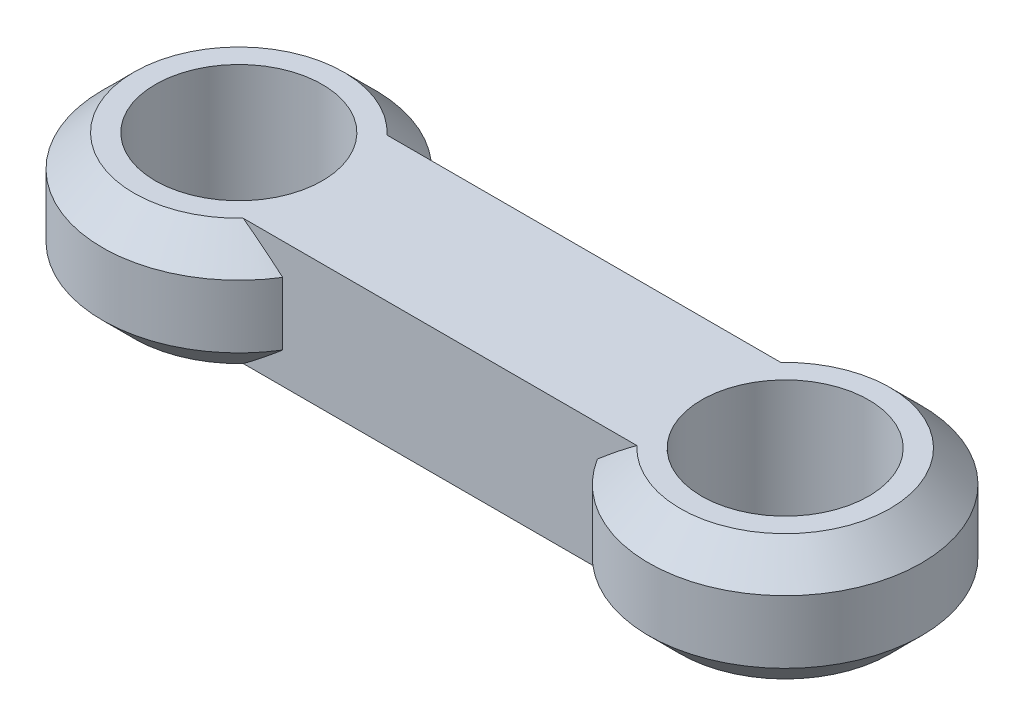
ISO-10303-21;
HEADER;
FILE_DESCRIPTION(('STEP AP214'),'2;1');
FILE_NAME('part.step','',(''),(''),'','','');
FILE_SCHEMA(('AUTOMOTIVE_DESIGN { 1 0 10303 214 1 1 1 1 }'));
ENDSEC;
DATA;
#1=APPLICATION_CONTEXT('core data for automotive mechanical design processes');
#2=APPLICATION_PROTOCOL_DEFINITION('international standard','automotive_design',2000,#1);
#3=PRODUCT_CONTEXT('',#1,'mechanical');
#4=PRODUCT('Part','Part','',(#3));
#5=PRODUCT_RELATED_PRODUCT_CATEGORY('part','',(#4));
#6=PRODUCT_DEFINITION_FORMATION('','',#4);
#7=PRODUCT_DEFINITION_CONTEXT('part definition',#1,'design');
#8=PRODUCT_DEFINITION('design','',#6,#7);
#9=PRODUCT_DEFINITION_SHAPE('','',#8);
#10=(LENGTH_UNIT() NAMED_UNIT(*) SI_UNIT(.MILLI.,.METRE.));
#11=(NAMED_UNIT(*) PLANE_ANGLE_UNIT() SI_UNIT($,.RADIAN.));
#12=(NAMED_UNIT(*) SI_UNIT($,.STERADIAN.) SOLID_ANGLE_UNIT());
#13=UNCERTAINTY_MEASURE_WITH_UNIT(LENGTH_MEASURE(1.E-05),#10,'distance_accuracy_value','');
#14=(GEOMETRIC_REPRESENTATION_CONTEXT(3) GLOBAL_UNCERTAINTY_ASSIGNED_CONTEXT((#13)) GLOBAL_UNIT_ASSIGNED_CONTEXT((#10,
#11,#12)) REPRESENTATION_CONTEXT('',''));
#15=CARTESIAN_POINT('',(0.,0.,0.));
#16=DIRECTION('',(0.,0.,1.));
#17=DIRECTION('',(1.,0.,0.));
#18=AXIS2_PLACEMENT_3D('',#15,#16,#17);
#19=CARTESIAN_POINT('',(-26.0425410570889,6.,0.));
#20=DIRECTION('',(0.,-1.,0.));
#21=DIRECTION('',(0.,0.,-1.));
#22=AXIS2_PLACEMENT_3D('',#19,#20,#21);
#23=CYLINDRICAL_SURFACE('',#22,6.5);
#24=DIRECTION('',(0.,-1.,0.));
#25=VECTOR('',#24,1.);
#26=CARTESIAN_POINT('',(-20.5212705285445,6.,-3.43009792143407));
#27=LINE('',#26,#25);
#28=CARTESIAN_POINT('',(-20.5212705285445,4.49999999999999,-3.43009792143407));
#29=VERTEX_POINT('',#28);
#30=CARTESIAN_POINT('',(-20.5212705285445,1.5,-3.43009792143407));
#31=VERTEX_POINT('',#30);
#32=EDGE_CURVE('E142',#29,#31,#27,.T.);
#33=ORIENTED_EDGE('',*,*,#32,.T.);
#34=CARTESIAN_POINT('',(-26.0425410570889,1.5,0.));
#35=DIRECTION('',(0.,1.,0.));
#36=DIRECTION('',(0.,0.,1.));
#37=AXIS2_PLACEMENT_3D('',#34,#35,#36);
#38=CIRCLE('',#37,6.5);
#39=CARTESIAN_POINT('',(-20.5212705285445,1.5,3.43009792143407));
#40=VERTEX_POINT('',#39);
#41=EDGE_CURVE('E167',#31,#40,#38,.T.);
#42=ORIENTED_EDGE('',*,*,#41,.T.);
#43=DIRECTION('',(0.,-1.,0.));
#44=VECTOR('',#43,1.);
#45=CARTESIAN_POINT('',(-20.5212705285445,6.,3.43009792143407));
#46=LINE('',#45,#44);
#47=CARTESIAN_POINT('',(-20.5212705285445,4.49999999999999,3.43009792143407));
#48=VERTEX_POINT('',#47);
#49=EDGE_CURVE('E147',#48,#40,#46,.T.);
#50=ORIENTED_EDGE('',*,*,#49,.F.);
#51=CARTESIAN_POINT('',(-26.0425410570889,4.49999999999999,0.));
#52=DIRECTION('',(0.,1.,0.));
#53=DIRECTION('',(0.,0.,1.));
#54=AXIS2_PLACEMENT_3D('',#51,#52,#53);
#55=CIRCLE('',#54,6.5);
#56=EDGE_CURVE('E164',#48,#29,#55,.F.);
#57=ORIENTED_EDGE('',*,*,#56,.T.);
#58=EDGE_LOOP('',(#33,#42,#50,#57));
#59=FACE_BOUND('',#58,.T.);
#60=ADVANCED_FACE('F49',(#59),#23,.T.);
#61=CARTESIAN_POINT('',(0.,6.,3.43009792143407));
#62=DIRECTION('',(0.,0.,1.));
#63=DIRECTION('',(1.,0.,0.));
#64=AXIS2_PLACEMENT_3D('',#61,#62,#63);
#65=PLANE('',#64);
#66=DIRECTION('',(-1.,0.,0.));
#67=VECTOR('',#66,1.);
#68=CARTESIAN_POINT('',(0.,0.,3.43009792143407));
#69=LINE('',#68,#67);
#70=CARTESIAN_POINT('',(-3.63791537138697,0.,3.43009792143407));
#71=VERTEX_POINT('',#70);
#72=CARTESIAN_POINT('',(-22.404625685702,0.,3.43009792143408));
#73=VERTEX_POINT('',#72);
#74=EDGE_CURVE('E270',#71,#73,#69,.T.);
#75=ORIENTED_EDGE('',*,*,#74,.F.);
#76=CARTESIAN_POINT('',(-3.63791537138697,0.,3.43009792143407));
#77=CARTESIAN_POINT('',(-3.71907569512446,0.0590566387520791,3.43009792143407));
#78=CARTESIAN_POINT('',(-3.79979677216606,0.118711737150157,3.43009792143407));
#79=CARTESIAN_POINT('',(-3.96044747830371,0.239071704787263,3.43009792143407));
#80=CARTESIAN_POINT('',(-4.04037714145387,0.299776528545755,3.43009792143407));
#81=CARTESIAN_POINT('',(-4.2790659016397,0.483211032410562,3.43009792143407));
#82=CARTESIAN_POINT('',(-4.43677984271871,0.607301105979159,3.43009792143407));
#83=CARTESIAN_POINT('',(-4.74995938949537,0.858232668240092,3.43009792143407));
#84=CARTESIAN_POINT('',(-4.90542528063672,0.985073802414717,3.43009792143407));
#85=CARTESIAN_POINT('',(-5.21458749276917,1.24100265865714,3.43009792143407));
#86=CARTESIAN_POINT('',(-5.36828319781378,1.37009112566234,3.43009792143407));
#87=CARTESIAN_POINT('',(-5.52127052854446,1.50000000000001,3.43009792143407));
#88=B_SPLINE_CURVE_WITH_KNOTS('',3,(#76,#77,#78,#79,#80,#81,#82,#83,#84,#85,#86,#87),
.UNSPECIFIED.,.F.,.F.,(4,2,2,2,2,4),(0.,0.301110719786002,0.602208426135549,1.20419905540656,
1.80611256423481,2.40822954254026),.UNSPECIFIED.);
#89=CARTESIAN_POINT('',(-5.52127052854446,1.50000000000001,3.43009792143407));
#90=VERTEX_POINT('',#89);
#91=EDGE_CURVE('E185',#71,#90,#88,.T.);
#92=ORIENTED_EDGE('',*,*,#91,.T.);
#93=DIRECTION('',(0.,-1.,0.));
#94=VECTOR('',#93,1.);
#95=CARTESIAN_POINT('',(-5.52127052854446,6.,3.43009792143407));
#96=LINE('',#95,#94);
#97=CARTESIAN_POINT('',(-5.52127052854446,4.5,3.43009792143407));
#98=VERTEX_POINT('',#97);
#99=EDGE_CURVE('E141',#98,#90,#96,.T.);
#100=ORIENTED_EDGE('',*,*,#99,.F.);
#101=CARTESIAN_POINT('',(-5.52127052854446,4.5,3.43009792143407));
#102=CARTESIAN_POINT('',(-5.36828319781378,4.62990887433767,3.43009792143407));
#103=CARTESIAN_POINT('',(-5.21458749276918,4.75899734134287,3.43009792143407));
#104=CARTESIAN_POINT('',(-4.90542528063673,5.01492619758529,3.43009792143407));
#105=CARTESIAN_POINT('',(-4.74995938949538,5.14176733175991,3.43009792143407));
#106=CARTESIAN_POINT('',(-4.43677984271872,5.39269889402084,3.43009792143407));
#107=CARTESIAN_POINT('',(-4.27906590163971,5.51678896758944,3.43009792143407));
#108=CARTESIAN_POINT('',(-4.04037714145388,5.70022347145425,3.43009792143407));
#109=CARTESIAN_POINT('',(-3.96044747830372,5.76092829521274,3.43009792143407));
#110=CARTESIAN_POINT('',(-3.79979677216608,5.88128826284984,3.43009792143407));
#111=CARTESIAN_POINT('',(-3.71907569512448,5.94094336124792,3.43009792143407));
#112=CARTESIAN_POINT('',(-3.63791537138699,6.,3.43009792143407));
#113=B_SPLINE_CURVE_WITH_KNOTS('',3,(#101,#102,#103,#104,#105,#106,#107,#108,#109,#110,#111,
#112),.UNSPECIFIED.,.F.,.F.,(4,2,2,2,2,4),(0.,0.602116978305447,1.20403048713369,
1.8060211164047,2.10711882275425,2.40822954254024),.UNSPECIFIED.);
#114=CARTESIAN_POINT('',(-3.63791537138699,6.,3.43009792143407));
#115=VERTEX_POINT('',#114);
#116=EDGE_CURVE('E129',#98,#115,#113,.T.);
#117=ORIENTED_EDGE('',*,*,#116,.T.);
#118=DIRECTION('',(-1.,0.,0.));
#119=VECTOR('',#118,1.);
#120=CARTESIAN_POINT('',(0.,6.,3.43009792143407));
#121=LINE('',#120,#119);
#122=CARTESIAN_POINT('',(-22.4046256857019,6.,3.43009792143408));
#123=VERTEX_POINT('',#122);
#124=EDGE_CURVE('E79',#115,#123,#121,.T.);
#125=ORIENTED_EDGE('',*,*,#124,.T.);
#126=CARTESIAN_POINT('',(-22.4046256857019,6.,3.43009792143408));
#127=CARTESIAN_POINT('',(-22.3234653619645,5.94094336124792,3.43009792143408));
#128=CARTESIAN_POINT('',(-22.2427442849228,5.88128826284984,3.43009792143408));
#129=CARTESIAN_POINT('',(-22.0820935787852,5.76092829521274,3.43009792143408));
#130=CARTESIAN_POINT('',(-22.002163915635,5.70022347145424,3.43009792143408));
#131=CARTESIAN_POINT('',(-21.7634751554492,5.51678896758944,3.43009792143408));
#132=CARTESIAN_POINT('',(-21.6057612143702,5.39269889402084,3.43009792143408));
#133=CARTESIAN_POINT('',(-21.2925816675936,5.1417673317599,3.43009792143408));
#134=CARTESIAN_POINT('',(-21.1371157764522,5.01492619758528,3.43009792143408));
#135=CARTESIAN_POINT('',(-20.8279535643197,4.75899734134286,3.43009792143408));
#136=CARTESIAN_POINT('',(-20.6742578592751,4.62990887433766,3.43009792143408));
#137=CARTESIAN_POINT('',(-20.5212705285445,4.49999999999999,3.43009792143408));
#138=B_SPLINE_CURVE_WITH_KNOTS('',3,(#126,#127,#128,#129,#130,#131,#132,#133,#134,#135,#136,
#137),.UNSPECIFIED.,.F.,.F.,(4,2,2,2,2,4),(0.,0.301110719786002,0.602208426135548,
1.20419905540656,1.80611256423481,2.40822954254026),.UNSPECIFIED.);
#139=EDGE_CURVE('E65',#123,#48,#138,.T.);
#140=ORIENTED_EDGE('',*,*,#139,.T.);
#141=ORIENTED_EDGE('',*,*,#49,.T.);
#142=CARTESIAN_POINT('',(-20.5212705285445,1.5,3.43009792143407));
#143=CARTESIAN_POINT('',(-20.6742578592751,1.37009112566233,3.43009792143408));
#144=CARTESIAN_POINT('',(-20.8279535643197,1.24100265865714,3.43009792143408));
#145=CARTESIAN_POINT('',(-21.1371157764522,0.985073802414715,3.43009792143408));
#146=CARTESIAN_POINT('',(-21.2925816675936,0.858232668240091,3.43009792143408));
#147=CARTESIAN_POINT('',(-21.6057612143702,0.607301105979158,3.43009792143408));
#148=CARTESIAN_POINT('',(-21.7634751554492,0.483211032410562,3.43009792143408));
#149=CARTESIAN_POINT('',(-22.0021639156351,0.299776528545756,3.43009792143408));
#150=CARTESIAN_POINT('',(-22.0820935787852,0.239071704787264,3.43009792143408));
#151=CARTESIAN_POINT('',(-22.2427442849229,0.118711737150158,3.43009792143408));
#152=CARTESIAN_POINT('',(-22.3234653619645,0.0590566387520798,3.43009792143408));
#153=CARTESIAN_POINT('',(-22.404625685702,0.,3.43009792143408));
#154=B_SPLINE_CURVE_WITH_KNOTS('',3,(#142,#143,#144,#145,#146,#147,#148,#149,#150,#151,#152,
#153),.UNSPECIFIED.,.F.,.F.,(4,2,2,2,2,4),(0.,0.602116978305453,1.2040304871337,
1.80602111640471,2.10711882275426,2.40822954254026),.UNSPECIFIED.);
#155=EDGE_CURVE('E218',#40,#73,#154,.T.);
#156=ORIENTED_EDGE('',*,*,#155,.T.);
#157=EDGE_LOOP('',(#75,#92,#100,#117,#125,#140,#141,#156));
#158=FACE_BOUND('',#157,.T.);
#159=ADVANCED_FACE('F243',(#158),#65,.T.);
#160=CARTESIAN_POINT('',(0.,6.,0.));
#161=DIRECTION('',(0.,-1.,0.));
#162=DIRECTION('',(0.,0.,-1.));
#163=AXIS2_PLACEMENT_3D('',#160,#161,#162);
#164=CYLINDRICAL_SURFACE('',#163,6.5);
#165=ORIENTED_EDGE('',*,*,#99,.T.);
#166=CARTESIAN_POINT('',(0.,1.50000000000001,0.));
#167=DIRECTION('',(0.,1.,0.));
#168=DIRECTION('',(0.,0.,1.));
#169=AXIS2_PLACEMENT_3D('',#166,#167,#168);
#170=CIRCLE('',#169,6.5);
#171=CARTESIAN_POINT('',(-5.52127052854446,1.50000000000001,-3.43009792143407));
#172=VERTEX_POINT('',#171);
#173=EDGE_CURVE('E139',#90,#172,#170,.T.);
#174=ORIENTED_EDGE('',*,*,#173,.T.);
#175=DIRECTION('',(0.,-1.,0.));
#176=VECTOR('',#175,1.);
#177=CARTESIAN_POINT('',(-5.52127052854446,6.,-3.43009792143407));
#178=LINE('',#177,#176);
#179=CARTESIAN_POINT('',(-5.52127052854446,4.5,-3.43009792143407));
#180=VERTEX_POINT('',#179);
#181=EDGE_CURVE('E124',#180,#172,#178,.T.);
#182=ORIENTED_EDGE('',*,*,#181,.F.);
#183=CARTESIAN_POINT('',(0.,4.5,0.));
#184=DIRECTION('',(0.,1.,0.));
#185=DIRECTION('',(0.,0.,1.));
#186=AXIS2_PLACEMENT_3D('',#183,#184,#185);
#187=CIRCLE('',#186,6.5);
#188=EDGE_CURVE('E136',#180,#98,#187,.F.);
#189=ORIENTED_EDGE('',*,*,#188,.T.);
#190=EDGE_LOOP('',(#165,#174,#182,#189));
#191=FACE_BOUND('',#190,.T.);
#192=ADVANCED_FACE('F135',(#191),#164,.T.);
#193=CARTESIAN_POINT('',(0.,6.,-3.43009792143407));
#194=DIRECTION('',(0.,0.,1.));
#195=DIRECTION('',(1.,0.,0.));
#196=AXIS2_PLACEMENT_3D('',#193,#194,#195);
#197=PLANE('',#196);
#198=DIRECTION('',(-1.,0.,0.));
#199=VECTOR('',#198,1.);
#200=CARTESIAN_POINT('',(0.,0.,-3.43009792143407));
#201=LINE('',#200,#199);
#202=CARTESIAN_POINT('',(-3.63791537138697,0.,-3.43009792143407));
#203=VERTEX_POINT('',#202);
#204=CARTESIAN_POINT('',(-22.404625685702,0.,-3.43009792143407));
#205=VERTEX_POINT('',#204);
#206=EDGE_CURVE('E273',#203,#205,#201,.T.);
#207=ORIENTED_EDGE('',*,*,#206,.T.);
#208=CARTESIAN_POINT('',(-22.404625685702,0.,-3.43009792143407));
#209=CARTESIAN_POINT('',(-22.3234653619645,0.0590566387520793,-3.43009792143407));
#210=CARTESIAN_POINT('',(-22.2427442849229,0.118711737150157,-3.43009792143407));
#211=CARTESIAN_POINT('',(-22.0820935787852,0.239071704787263,-3.43009792143407));
#212=CARTESIAN_POINT('',(-22.0021639156351,0.299776528545755,-3.43009792143407));
#213=CARTESIAN_POINT('',(-21.7634751554492,0.483211032410562,-3.43009792143407));
#214=CARTESIAN_POINT('',(-21.6057612143702,0.607301105979158,-3.43009792143407));
#215=CARTESIAN_POINT('',(-21.2925816675936,0.858232668240091,-3.43009792143407));
#216=CARTESIAN_POINT('',(-21.1371157764522,0.985073802414715,-3.43009792143407));
#217=CARTESIAN_POINT('',(-20.8279535643198,1.24100265865714,-3.43009792143407));
#218=CARTESIAN_POINT('',(-20.6742578592751,1.37009112566233,-3.43009792143407));
#219=CARTESIAN_POINT('',(-20.5212705285445,1.5,-3.43009792143407));
#220=B_SPLINE_CURVE_WITH_KNOTS('',3,(#208,#209,#210,#211,#212,#213,#214,#215,#216,#217,#218,
#219),.UNSPECIFIED.,.F.,.F.,(4,2,2,2,2,4),(0.,0.301110719786001,0.60220842613555,
1.20419905540656,1.80611256423481,2.40822954254026),.UNSPECIFIED.);
#221=EDGE_CURVE('E130',#205,#31,#220,.T.);
#222=ORIENTED_EDGE('',*,*,#221,.T.);
#223=ORIENTED_EDGE('',*,*,#32,.F.);
#224=CARTESIAN_POINT('',(-20.5212705285445,4.49999999999999,-3.43009792143407));
#225=CARTESIAN_POINT('',(-20.6742578592751,4.62990887433766,-3.43009792143407));
#226=CARTESIAN_POINT('',(-20.8279535643197,4.75899734134286,-3.43009792143407));
#227=CARTESIAN_POINT('',(-21.1371157764522,5.01492619758528,-3.43009792143407));
#228=CARTESIAN_POINT('',(-21.2925816675936,5.14176733175991,-3.43009792143407));
#229=CARTESIAN_POINT('',(-21.6057612143702,5.39269889402084,-3.43009792143407));
#230=CARTESIAN_POINT('',(-21.7634751554492,5.51678896758944,-3.43009792143407));
#231=CARTESIAN_POINT('',(-22.002163915635,5.70022347145424,-3.43009792143407));
#232=CARTESIAN_POINT('',(-22.0820935787852,5.76092829521273,-3.43009792143407));
#233=CARTESIAN_POINT('',(-22.2427442849228,5.88128826284984,-3.43009792143407));
#234=CARTESIAN_POINT('',(-22.3234653619645,5.94094336124792,-3.43009792143407));
#235=CARTESIAN_POINT('',(-22.4046256857019,6.,-3.43009792143407));
#236=B_SPLINE_CURVE_WITH_KNOTS('',3,(#224,#225,#226,#227,#228,#229,#230,#231,#232,#233,#234,
#235),.UNSPECIFIED.,.F.,.F.,(4,2,2,2,2,4),(0.,0.602116978305452,1.2040304871337,
1.80602111640471,2.10711882275425,2.40822954254026),.UNSPECIFIED.);
#237=CARTESIAN_POINT('',(-22.4046256857019,6.,-3.43009792143407));
#238=VERTEX_POINT('',#237);
#239=EDGE_CURVE('E11',#29,#238,#236,.T.);
#240=ORIENTED_EDGE('',*,*,#239,.T.);
#241=DIRECTION('',(-1.,0.,0.));
#242=VECTOR('',#241,1.);
#243=CARTESIAN_POINT('',(0.,6.,-3.43009792143407));
#244=LINE('',#243,#242);
#245=CARTESIAN_POINT('',(-3.63791537138699,6.,-3.43009792143407));
#246=VERTEX_POINT('',#245);
#247=EDGE_CURVE('E71',#246,#238,#244,.T.);
#248=ORIENTED_EDGE('',*,*,#247,.F.);
#249=CARTESIAN_POINT('',(-3.63791537138699,6.,-3.43009792143407));
#250=CARTESIAN_POINT('',(-3.71907569512448,5.94094336124792,-3.43009792143407));
#251=CARTESIAN_POINT('',(-3.79979677216608,5.88128826284984,-3.43009792143407));
#252=CARTESIAN_POINT('',(-3.96044747830373,5.76092829521274,-3.43009792143407));
#253=CARTESIAN_POINT('',(-4.04037714145388,5.70022347145425,-3.43009792143407));
#254=CARTESIAN_POINT('',(-4.27906590163971,5.51678896758944,-3.43009792143407));
#255=CARTESIAN_POINT('',(-4.43677984271872,5.39269889402084,-3.43009792143407));
#256=CARTESIAN_POINT('',(-4.74995938949538,5.14176733175991,-3.43009792143407));
#257=CARTESIAN_POINT('',(-4.90542528063673,5.01492619758529,-3.43009792143407));
#258=CARTESIAN_POINT('',(-5.21458749276918,4.75899734134287,-3.43009792143407));
#259=CARTESIAN_POINT('',(-5.36828319781378,4.62990887433767,-3.43009792143407));
#260=CARTESIAN_POINT('',(-5.52127052854446,4.5,-3.43009792143407));
#261=B_SPLINE_CURVE_WITH_KNOTS('',3,(#249,#250,#251,#252,#253,#254,#255,#256,#257,#258,#259,
#260),.UNSPECIFIED.,.F.,.F.,(4,2,2,2,2,4),(0.,0.301110719785999,0.602208426135543,
1.20419905540655,1.8061125642348,2.40822954254024),.UNSPECIFIED.);
#262=EDGE_CURVE('E120',#246,#180,#261,.T.);
#263=ORIENTED_EDGE('',*,*,#262,.T.);
#264=ORIENTED_EDGE('',*,*,#181,.T.);
#265=CARTESIAN_POINT('',(-5.52127052854446,1.50000000000001,-3.43009792143407));
#266=CARTESIAN_POINT('',(-5.36828319781378,1.37009112566234,-3.43009792143407));
#267=CARTESIAN_POINT('',(-5.21458749276918,1.24100265865714,-3.43009792143407));
#268=CARTESIAN_POINT('',(-4.90542528063672,0.985073802414717,-3.43009792143407));
#269=CARTESIAN_POINT('',(-4.74995938949537,0.858232668240093,-3.43009792143407));
#270=CARTESIAN_POINT('',(-4.43677984271871,0.607301105979159,-3.43009792143407));
#271=CARTESIAN_POINT('',(-4.2790659016397,0.483211032410562,-3.43009792143407));
#272=CARTESIAN_POINT('',(-4.04037714145387,0.299776528545755,-3.43009792143407));
#273=CARTESIAN_POINT('',(-3.96044747830371,0.239071704787263,-3.43009792143407));
#274=CARTESIAN_POINT('',(-3.79979677216606,0.118711737150157,-3.43009792143407));
#275=CARTESIAN_POINT('',(-3.71907569512446,0.0590566387520794,-3.43009792143407));
#276=CARTESIAN_POINT('',(-3.63791537138697,0.,-3.43009792143407));
#277=B_SPLINE_CURVE_WITH_KNOTS('',3,(#265,#266,#267,#268,#269,#270,#271,#272,#273,#274,#275,
#276),.UNSPECIFIED.,.F.,.F.,(4,2,2,2,2,4),(0.,0.602116978305451,1.2040304871337,
1.80602111640471,2.10711882275426,2.40822954254026),.UNSPECIFIED.);
#278=EDGE_CURVE('E177',#172,#203,#277,.T.);
#279=ORIENTED_EDGE('',*,*,#278,.T.);
#280=EDGE_LOOP('',(#207,#222,#223,#240,#248,#263,#264,#279));
#281=FACE_BOUND('',#280,.T.);
#282=ADVANCED_FACE('F122',(#281),#197,.F.);
#283=CARTESIAN_POINT('',(-26.0425410570889,6.,0.));
#284=DIRECTION('',(0.,-1.,0.));
#285=DIRECTION('',(0.,0.,-1.));
#286=AXIS2_PLACEMENT_3D('',#283,#284,#285);
#287=CYLINDRICAL_SURFACE('',#286,3.97999999999997);
#288=CARTESIAN_POINT('',(-26.0425410570889,6.,0.));
#289=DIRECTION('',(0.,1.,0.));
#290=DIRECTION('',(0.,0.,1.));
#291=AXIS2_PLACEMENT_3D('',#288,#289,#290);
#292=CIRCLE('',#291,3.97999999999997);
#293=CARTESIAN_POINT('',(-26.0425410570889,6.,3.97999999999997));
#294=VERTEX_POINT('',#293);
#295=EDGE_CURVE('E289',#294,#294,#292,.T.);
#296=ORIENTED_EDGE('',*,*,#295,.T.);
#297=EDGE_LOOP('',(#296));
#298=FACE_BOUND('',#297,.T.);
#299=CARTESIAN_POINT('',(-26.0425410570889,0.,0.));
#300=DIRECTION('',(0.,1.,0.));
#301=DIRECTION('',(0.,0.,1.));
#302=AXIS2_PLACEMENT_3D('',#299,#300,#301);
#303=CIRCLE('',#302,3.97999999999997);
#304=CARTESIAN_POINT('',(-26.0425410570889,0.,3.97999999999997));
#305=VERTEX_POINT('',#304);
#306=EDGE_CURVE('E280',#305,#305,#303,.T.);
#307=ORIENTED_EDGE('',*,*,#306,.F.);
#308=EDGE_LOOP('',(#307));
#309=FACE_BOUND('',#308,.T.);
#310=ADVANCED_FACE('F207',(#298,#309),#287,.F.);
#311=CARTESIAN_POINT('',(0.,6.,0.));
#312=DIRECTION('',(0.,-1.,0.));
#313=DIRECTION('',(0.,0.,-1.));
#314=AXIS2_PLACEMENT_3D('',#311,#312,#313);
#315=CYLINDRICAL_SURFACE('',#314,3.98);
#316=CARTESIAN_POINT('',(0.,6.,0.));
#317=DIRECTION('',(0.,1.,0.));
#318=DIRECTION('',(0.,0.,1.));
#319=AXIS2_PLACEMENT_3D('',#316,#317,#318);
#320=CIRCLE('',#319,3.98);
#321=CARTESIAN_POINT('',(0.,6.,3.98));
#322=VERTEX_POINT('',#321);
#323=EDGE_CURVE('E262',#322,#322,#320,.T.);
#324=ORIENTED_EDGE('',*,*,#323,.T.);
#325=EDGE_LOOP('',(#324));
#326=FACE_BOUND('',#325,.T.);
#327=CARTESIAN_POINT('',(0.,0.,0.));
#328=DIRECTION('',(0.,1.,0.));
#329=DIRECTION('',(0.,0.,1.));
#330=AXIS2_PLACEMENT_3D('',#327,#328,#329);
#331=CIRCLE('',#330,3.98);
#332=CARTESIAN_POINT('',(0.,0.,3.98));
#333=VERTEX_POINT('',#332);
#334=EDGE_CURVE('E276',#333,#333,#331,.T.);
#335=ORIENTED_EDGE('',*,*,#334,.F.);
#336=EDGE_LOOP('',(#335));
#337=FACE_BOUND('',#336,.T.);
#338=ADVANCED_FACE('F304',(#326,#337),#315,.F.);
#339=CARTESIAN_POINT('',(0.,6.,0.));
#340=DIRECTION('',(0.,1.,0.));
#341=DIRECTION('',(0.,0.,1.));
#342=AXIS2_PLACEMENT_3D('',#339,#340,#341);
#343=PLANE('',#342);
#344=ORIENTED_EDGE('',*,*,#295,.F.);
#345=EDGE_LOOP('',(#344));
#346=FACE_BOUND('',#345,.T.);
#347=CARTESIAN_POINT('',(0.,6.,0.));
#348=DIRECTION('',(0.,1.,0.));
#349=DIRECTION('',(0.,0.,1.));
#350=AXIS2_PLACEMENT_3D('',#347,#348,#349);
#351=CIRCLE('',#350,5.00000000000001);
#352=EDGE_CURVE('E174',#115,#246,#351,.T.);
#353=ORIENTED_EDGE('',*,*,#352,.T.);
#354=ORIENTED_EDGE('',*,*,#247,.T.);
#355=CARTESIAN_POINT('',(-26.0425410570889,6.,0.));
#356=DIRECTION('',(0.,1.,0.));
#357=DIRECTION('',(0.,0.,1.));
#358=AXIS2_PLACEMENT_3D('',#355,#356,#357);
#359=CIRCLE('',#358,5.);
#360=EDGE_CURVE('E171',#238,#123,#359,.T.);
#361=ORIENTED_EDGE('',*,*,#360,.T.);
#362=ORIENTED_EDGE('',*,*,#124,.F.);
#363=EDGE_LOOP('',(#353,#354,#361,#362));
#364=FACE_BOUND('',#363,.T.);
#365=ORIENTED_EDGE('',*,*,#323,.F.);
#366=EDGE_LOOP('',(#365));
#367=FACE_BOUND('',#366,.T.);
#368=ADVANCED_FACE('F307',(#346,#364,#367),#343,.T.);
#369=CARTESIAN_POINT('',(0.,0.,0.));
#370=DIRECTION('',(0.,1.,0.));
#371=DIRECTION('',(0.,0.,1.));
#372=AXIS2_PLACEMENT_3D('',#369,#370,#371);
#373=PLANE('',#372);
#374=ORIENTED_EDGE('',*,*,#306,.T.);
#375=EDGE_LOOP('',(#374));
#376=FACE_BOUND('',#375,.T.);
#377=ORIENTED_EDGE('',*,*,#206,.F.);
#378=CARTESIAN_POINT('',(0.,0.,0.));
#379=DIRECTION('',(0.,1.,0.));
#380=DIRECTION('',(0.,0.,1.));
#381=AXIS2_PLACEMENT_3D('',#378,#379,#380);
#382=CIRCLE('',#381,4.99999999999999);
#383=EDGE_CURVE('E160',#203,#71,#382,.F.);
#384=ORIENTED_EDGE('',*,*,#383,.T.);
#385=ORIENTED_EDGE('',*,*,#74,.T.);
#386=CARTESIAN_POINT('',(-26.0425410570889,0.,0.));
#387=DIRECTION('',(0.,1.,0.));
#388=DIRECTION('',(0.,0.,1.));
#389=AXIS2_PLACEMENT_3D('',#386,#387,#388);
#390=CIRCLE('',#389,4.99999999999999);
#391=EDGE_CURVE('E151',#73,#205,#390,.F.);
#392=ORIENTED_EDGE('',*,*,#391,.T.);
#393=EDGE_LOOP('',(#377,#384,#385,#392));
#394=FACE_BOUND('',#393,.T.);
#395=ORIENTED_EDGE('',*,*,#334,.T.);
#396=EDGE_LOOP('',(#395));
#397=FACE_BOUND('',#396,.T.);
#398=ADVANCED_FACE('F205',(#376,#394,#397),#373,.F.);
#399=CARTESIAN_POINT('',(0.,1.50000000000001,0.));
#400=DIRECTION('',(0.,1.,0.));
#401=DIRECTION('',(0.,0.,1.));
#402=AXIS2_PLACEMENT_3D('',#399,#400,#401);
#403=CONICAL_SURFACE('',#402,6.5,0.785398163397449);
#404=ORIENTED_EDGE('',*,*,#91,.F.);
#405=ORIENTED_EDGE('',*,*,#383,.F.);
#406=ORIENTED_EDGE('',*,*,#278,.F.);
#407=ORIENTED_EDGE('',*,*,#173,.F.);
#408=EDGE_LOOP('',(#404,#405,#406,#407));
#409=FACE_BOUND('',#408,.T.);
#410=ADVANCED_FACE('F196',(#409),#403,.T.);
#411=CARTESIAN_POINT('',(-26.0425410570889,1.5,0.));
#412=DIRECTION('',(0.,1.,0.));
#413=DIRECTION('',(0.,0.,1.));
#414=AXIS2_PLACEMENT_3D('',#411,#412,#413);
#415=CONICAL_SURFACE('',#414,6.5,0.785398163397449);
#416=ORIENTED_EDGE('',*,*,#221,.F.);
#417=ORIENTED_EDGE('',*,*,#391,.F.);
#418=ORIENTED_EDGE('',*,*,#155,.F.);
#419=ORIENTED_EDGE('',*,*,#41,.F.);
#420=EDGE_LOOP('',(#416,#417,#418,#419));
#421=FACE_BOUND('',#420,.T.);
#422=ADVANCED_FACE('F204',(#421),#415,.T.);
#423=CARTESIAN_POINT('',(0.,6.,0.));
#424=DIRECTION('',(0.,-1.,0.));
#425=DIRECTION('',(0.,0.,-1.));
#426=AXIS2_PLACEMENT_3D('',#423,#424,#425);
#427=CONICAL_SURFACE('',#426,5.00000000000001,0.785398163397447);
#428=ORIENTED_EDGE('',*,*,#116,.F.);
#429=ORIENTED_EDGE('',*,*,#188,.F.);
#430=ORIENTED_EDGE('',*,*,#262,.F.);
#431=ORIENTED_EDGE('',*,*,#352,.F.);
#432=EDGE_LOOP('',(#428,#429,#430,#431));
#433=FACE_BOUND('',#432,.T.);
#434=ADVANCED_FACE('F145',(#433),#427,.T.);
#435=CARTESIAN_POINT('',(-26.0425410570889,6.,0.));
#436=DIRECTION('',(0.,-1.,0.));
#437=DIRECTION('',(0.,0.,-1.));
#438=AXIS2_PLACEMENT_3D('',#435,#436,#437);
#439=CONICAL_SURFACE('',#438,5.,0.785398163397444);
#440=ORIENTED_EDGE('',*,*,#239,.F.);
#441=ORIENTED_EDGE('',*,*,#56,.F.);
#442=ORIENTED_EDGE('',*,*,#139,.F.);
#443=ORIENTED_EDGE('',*,*,#360,.F.);
#444=EDGE_LOOP('',(#440,#441,#442,#443));
#445=FACE_BOUND('',#444,.T.);
#446=ADVANCED_FACE('F52',(#445),#439,.T.);
#447=CLOSED_SHELL('',(#60,#159,#192,#282,#310,#338,#368,#398,#410,#422,#434,#446));
#448=MANIFOLD_SOLID_BREP('B2',#447);
#449=ADVANCED_BREP_SHAPE_REPRESENTATION('',(#18,#448),#14);
#450=SHAPE_DEFINITION_REPRESENTATION(#9,#449);
ENDSEC;
END-ISO-10303-21;
